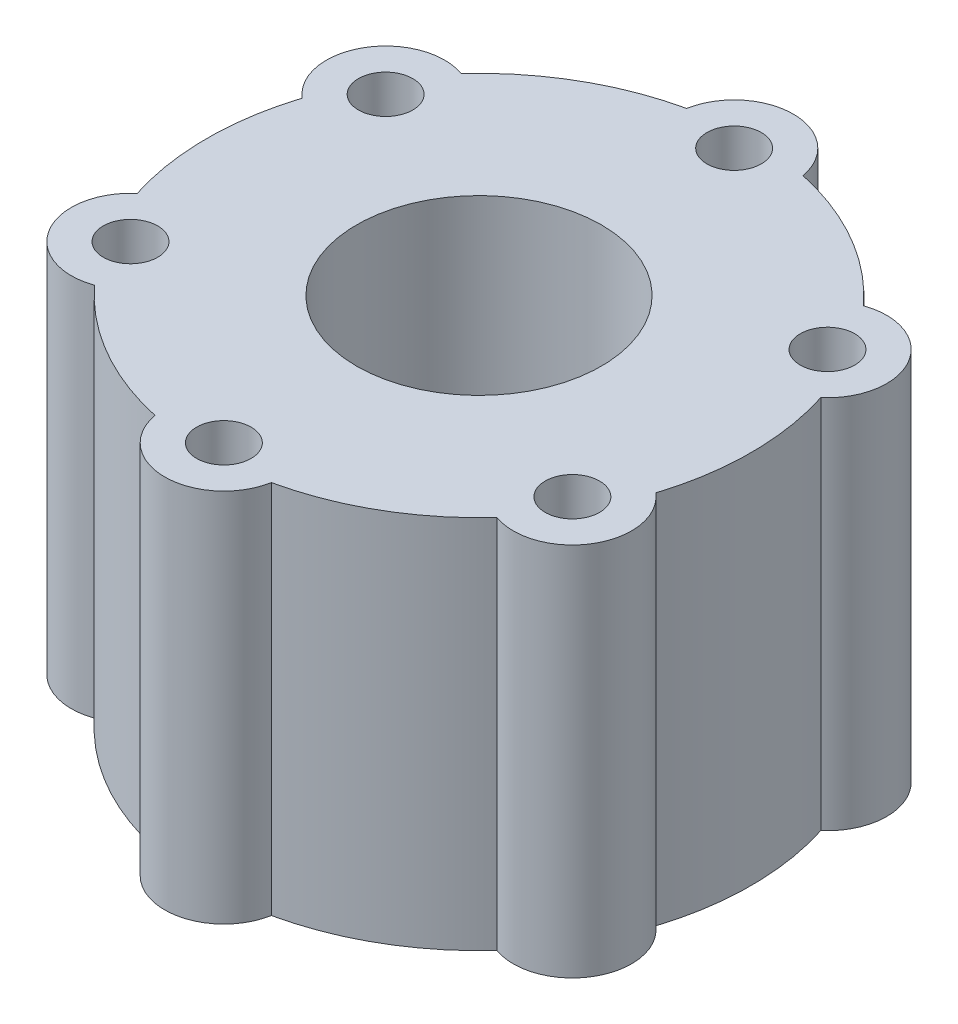
ISO-10303-21;
HEADER;
FILE_DESCRIPTION(('STEP AP214'),'2;1');
FILE_NAME('part.step','',(''),(''),'','','');
FILE_SCHEMA(('AUTOMOTIVE_DESIGN { 1 0 10303 214 1 1 1 1 }'));
ENDSEC;
DATA;
#1=APPLICATION_CONTEXT('core data for automotive mechanical design processes');
#2=APPLICATION_PROTOCOL_DEFINITION('international standard','automotive_design',2000,#1);
#3=PRODUCT_CONTEXT('',#1,'mechanical');
#4=PRODUCT('Part','Part','',(#3));
#5=PRODUCT_RELATED_PRODUCT_CATEGORY('part','',(#4));
#6=PRODUCT_DEFINITION_FORMATION('','',#4);
#7=PRODUCT_DEFINITION_CONTEXT('part definition',#1,'design');
#8=PRODUCT_DEFINITION('design','',#6,#7);
#9=PRODUCT_DEFINITION_SHAPE('','',#8);
#10=(LENGTH_UNIT() NAMED_UNIT(*) SI_UNIT(.MILLI.,.METRE.));
#11=(NAMED_UNIT(*) PLANE_ANGLE_UNIT() SI_UNIT($,.RADIAN.));
#12=(NAMED_UNIT(*) SI_UNIT($,.STERADIAN.) SOLID_ANGLE_UNIT());
#13=UNCERTAINTY_MEASURE_WITH_UNIT(LENGTH_MEASURE(1.E-05),#10,'distance_accuracy_value','');
#14=(GEOMETRIC_REPRESENTATION_CONTEXT(3) GLOBAL_UNCERTAINTY_ASSIGNED_CONTEXT((#13)) GLOBAL_UNIT_ASSIGNED_CONTEXT((#10,
#11,#12)) REPRESENTATION_CONTEXT('',''));
#15=CARTESIAN_POINT('',(0.,0.,0.));
#16=DIRECTION('',(0.,0.,1.));
#17=DIRECTION('',(1.,0.,0.));
#18=AXIS2_PLACEMENT_3D('',#15,#16,#17);
#19=CARTESIAN_POINT('',(0.,0.,-11.90625));
#20=DIRECTION('',(0.,1.,0.));
#21=DIRECTION('',(0.,0.,1.));
#22=AXIS2_PLACEMENT_3D('',#19,#20,#21);
#23=PLANE('',#22);
#24=CARTESIAN_POINT('',(0.,0.,0.));
#25=DIRECTION('',(0.,1.,0.));
#26=DIRECTION('',(0.,0.,1.));
#27=AXIS2_PLACEMENT_3D('',#24,#25,#26);
#28=CIRCLE('',#27,25.4);
#29=CARTESIAN_POINT('',(18.7712276945068,0.,-17.1114292460034));
#30=VERTEX_POINT('',#29);
#31=CARTESIAN_POINT('',(5.43331857484525,0.,-24.8120746666667));
#32=VERTEX_POINT('',#31);
#33=EDGE_CURVE('E226',#30,#32,#28,.T.);
#34=ORIENTED_EDGE('',*,*,#33,.F.);
#35=CARTESIAN_POINT('',(20.6222299276168,0.,-11.9062500000003));
#36=DIRECTION('',(0.,1.,0.));
#37=DIRECTION('',(0.,0.,1.));
#38=AXIS2_PLACEMENT_3D('',#35,#36,#37);
#39=CIRCLE('',#38,5.5245);
#40=CARTESIAN_POINT('',(24.2045462693522,0.,-7.70064542066379));
#41=VERTEX_POINT('',#40);
#42=EDGE_CURVE('E53',#41,#30,#39,.T.);
#43=ORIENTED_EDGE('',*,*,#42,.F.);
#44=CARTESIAN_POINT('',(0.,0.,0.));
#45=DIRECTION('',(0.,1.,0.));
#46=DIRECTION('',(0.,0.,1.));
#47=AXIS2_PLACEMENT_3D('',#44,#45,#46);
#48=CIRCLE('',#47,25.4);
#49=CARTESIAN_POINT('',(24.2045462693524,0.,7.70064542066291));
#50=VERTEX_POINT('',#49);
#51=EDGE_CURVE('E61',#50,#41,#48,.T.);
#52=ORIENTED_EDGE('',*,*,#51,.F.);
#53=CARTESIAN_POINT('',(20.6222299276172,0.,11.9062499999995));
#54=DIRECTION('',(0.,1.,0.));
#55=DIRECTION('',(0.,0.,1.));
#56=AXIS2_PLACEMENT_3D('',#53,#54,#55);
#57=CIRCLE('',#56,5.5245);
#58=CARTESIAN_POINT('',(18.7712276945074,0.,17.1114292460027));
#59=VERTEX_POINT('',#58);
#60=EDGE_CURVE('E244',#59,#50,#57,.T.);
#61=ORIENTED_EDGE('',*,*,#60,.F.);
#62=CARTESIAN_POINT('',(0.,0.,0.));
#63=DIRECTION('',(0.,1.,0.));
#64=DIRECTION('',(0.,0.,1.));
#65=AXIS2_PLACEMENT_3D('',#62,#63,#64);
#66=CIRCLE('',#65,25.4);
#67=CARTESIAN_POINT('',(5.43331857484614,0.,24.8120746666665));
#68=VERTEX_POINT('',#67);
#69=EDGE_CURVE('E242',#68,#59,#66,.T.);
#70=ORIENTED_EDGE('',*,*,#69,.F.);
#71=CARTESIAN_POINT('',(8.6909646146438E-13,0.,23.8125));
#72=DIRECTION('',(0.,1.,0.));
#73=DIRECTION('',(0.,0.,1.));
#74=AXIS2_PLACEMENT_3D('',#71,#72,#73);
#75=CIRCLE('',#74,5.5245);
#76=CARTESIAN_POINT('',(-5.43331857484434,0.,24.8120746666669));
#77=VERTEX_POINT('',#76);
#78=EDGE_CURVE('E240',#77,#68,#75,.T.);
#79=ORIENTED_EDGE('',*,*,#78,.F.);
#80=CARTESIAN_POINT('',(0.,0.,0.));
#81=DIRECTION('',(0.,1.,0.));
#82=DIRECTION('',(0.,0.,1.));
#83=AXIS2_PLACEMENT_3D('',#80,#81,#82);
#84=CIRCLE('',#83,25.4);
#85=CARTESIAN_POINT('',(-18.7712276945066,0.,17.1114292460036));
#86=VERTEX_POINT('',#85);
#87=EDGE_CURVE('E238',#86,#77,#84,.T.);
#88=ORIENTED_EDGE('',*,*,#87,.F.);
#89=CARTESIAN_POINT('',(-20.6222299276167,0.,11.9062500000005));
#90=DIRECTION('',(0.,1.,0.));
#91=DIRECTION('',(0.,0.,1.));
#92=AXIS2_PLACEMENT_3D('',#89,#90,#91);
#93=CIRCLE('',#92,5.5245);
#94=CARTESIAN_POINT('',(-24.2045462693521,0.,7.70064542066408));
#95=VERTEX_POINT('',#94);
#96=EDGE_CURVE('E236',#95,#86,#93,.T.);
#97=ORIENTED_EDGE('',*,*,#96,.F.);
#98=CARTESIAN_POINT('',(0.,0.,0.));
#99=DIRECTION('',(0.,1.,0.));
#100=DIRECTION('',(0.,0.,1.));
#101=AXIS2_PLACEMENT_3D('',#98,#99,#100);
#102=CIRCLE('',#101,25.4);
#103=CARTESIAN_POINT('',(-24.2045462693523,0.,-7.70064542066321));
#104=VERTEX_POINT('',#103);
#105=EDGE_CURVE('E234',#104,#95,#102,.T.);
#106=ORIENTED_EDGE('',*,*,#105,.F.);
#107=CARTESIAN_POINT('',(-20.6222299276171,0.,-11.9062499999997));
#108=DIRECTION('',(0.,1.,0.));
#109=DIRECTION('',(0.,0.,1.));
#110=AXIS2_PLACEMENT_3D('',#107,#108,#109);
#111=CIRCLE('',#110,5.5245);
#112=CARTESIAN_POINT('',(-18.7712276945072,0.,-17.1114292460029));
#113=VERTEX_POINT('',#112);
#114=EDGE_CURVE('E134',#113,#104,#111,.T.);
#115=ORIENTED_EDGE('',*,*,#114,.F.);
#116=CARTESIAN_POINT('',(0.,0.,0.));
#117=DIRECTION('',(0.,1.,0.));
#118=DIRECTION('',(0.,0.,1.));
#119=AXIS2_PLACEMENT_3D('',#116,#117,#118);
#120=CIRCLE('',#119,25.4);
#121=CARTESIAN_POINT('',(-5.43331857484524,0.,-24.8120746666667));
#122=VERTEX_POINT('',#121);
#123=EDGE_CURVE('E231',#122,#113,#120,.T.);
#124=ORIENTED_EDGE('',*,*,#123,.F.);
#125=CARTESIAN_POINT('',(0.,0.,-23.8125));
#126=DIRECTION('',(0.,1.,0.));
#127=DIRECTION('',(0.,0.,1.));
#128=AXIS2_PLACEMENT_3D('',#125,#126,#127);
#129=CIRCLE('',#128,5.52450000000001);
#130=EDGE_CURVE('E229',#32,#122,#129,.T.);
#131=ORIENTED_EDGE('',*,*,#130,.F.);
#132=EDGE_LOOP('',(#34,#43,#52,#61,#70,#79,#88,#97,#106,#115,#124,#131));
#133=FACE_BOUND('',#132,.T.);
#134=CARTESIAN_POINT('',(0.,0.,-23.8125));
#135=DIRECTION('',(0.,1.,0.));
#136=DIRECTION('',(0.,0.,1.));
#137=AXIS2_PLACEMENT_3D('',#134,#135,#136);
#138=CIRCLE('',#137,2.54);
#139=CARTESIAN_POINT('',(0.,0.,-21.2725));
#140=VERTEX_POINT('',#139);
#141=EDGE_CURVE('E223',#140,#140,#138,.T.);
#142=ORIENTED_EDGE('',*,*,#141,.T.);
#143=EDGE_LOOP('',(#142));
#144=FACE_BOUND('',#143,.T.);
#145=CARTESIAN_POINT('',(20.6222299276168,0.,-11.9062500000003));
#146=DIRECTION('',(0.,1.,0.));
#147=DIRECTION('',(0.,0.,1.));
#148=AXIS2_PLACEMENT_3D('',#145,#146,#147);
#149=CIRCLE('',#148,2.54000000000032);
#150=CARTESIAN_POINT('',(20.6222299276168,0.,-9.36624999999993));
#151=VERTEX_POINT('',#150);
#152=EDGE_CURVE('E220',#151,#151,#149,.T.);
#153=ORIENTED_EDGE('',*,*,#152,.T.);
#154=EDGE_LOOP('',(#153));
#155=FACE_BOUND('',#154,.T.);
#156=CARTESIAN_POINT('',(20.6222299276172,0.,11.9062499999995));
#157=DIRECTION('',(0.,1.,0.));
#158=DIRECTION('',(0.,0.,1.));
#159=AXIS2_PLACEMENT_3D('',#156,#157,#158);
#160=CIRCLE('',#159,2.53999999999974);
#161=CARTESIAN_POINT('',(20.6222299276172,0.,14.4462499999992));
#162=VERTEX_POINT('',#161);
#163=EDGE_CURVE('E217',#162,#162,#160,.T.);
#164=ORIENTED_EDGE('',*,*,#163,.T.);
#165=EDGE_LOOP('',(#164));
#166=FACE_BOUND('',#165,.T.);
#167=CARTESIAN_POINT('',(8.6909646146438E-13,0.,23.8125));
#168=DIRECTION('',(0.,1.,0.));
#169=DIRECTION('',(0.,0.,1.));
#170=AXIS2_PLACEMENT_3D('',#167,#168,#169);
#171=CIRCLE('',#170,2.53999999999997);
#172=CARTESIAN_POINT('',(8.6909646146438E-13,0.,26.3525));
#173=VERTEX_POINT('',#172);
#174=EDGE_CURVE('E214',#173,#173,#171,.T.);
#175=ORIENTED_EDGE('',*,*,#174,.T.);
#176=EDGE_LOOP('',(#175));
#177=FACE_BOUND('',#176,.T.);
#178=CARTESIAN_POINT('',(-20.6222299276167,0.,11.9062500000005));
#179=DIRECTION('',(0.,1.,0.));
#180=DIRECTION('',(0.,0.,1.));
#181=AXIS2_PLACEMENT_3D('',#178,#179,#180);
#182=CIRCLE('',#181,2.54);
#183=CARTESIAN_POINT('',(-20.6222299276167,0.,14.4462500000005));
#184=VERTEX_POINT('',#183);
#185=EDGE_CURVE('E211',#184,#184,#182,.T.);
#186=ORIENTED_EDGE('',*,*,#185,.T.);
#187=EDGE_LOOP('',(#186));
#188=FACE_BOUND('',#187,.T.);
#189=CARTESIAN_POINT('',(-20.6222299276171,0.,-11.9062499999997));
#190=DIRECTION('',(0.,1.,0.));
#191=DIRECTION('',(0.,0.,1.));
#192=AXIS2_PLACEMENT_3D('',#189,#190,#191);
#193=CIRCLE('',#192,2.54);
#194=CARTESIAN_POINT('',(-20.6222299276171,0.,-9.36624999999975));
#195=VERTEX_POINT('',#194);
#196=EDGE_CURVE('E208',#195,#195,#193,.T.);
#197=ORIENTED_EDGE('',*,*,#196,.T.);
#198=EDGE_LOOP('',(#197));
#199=FACE_BOUND('',#198,.T.);
#200=CARTESIAN_POINT('',(0.,0.,0.));
#201=DIRECTION('',(0.,1.,0.));
#202=DIRECTION('',(0.,0.,1.));
#203=AXIS2_PLACEMENT_3D('',#200,#201,#202);
#204=CIRCLE('',#203,15.875);
#205=CARTESIAN_POINT('',(0.,0.,15.875));
#206=VERTEX_POINT('',#205);
#207=EDGE_CURVE('E187',#206,#206,#204,.T.);
#208=ORIENTED_EDGE('',*,*,#207,.T.);
#209=EDGE_LOOP('',(#208));
#210=FACE_BOUND('',#209,.T.);
#211=ADVANCED_FACE('F37',(#133,#144,#155,#166,#177,#188,#199,#210),#23,.F.);
#212=CARTESIAN_POINT('',(0.,4.699,0.));
#213=DIRECTION('',(0.,-1.,0.));
#214=DIRECTION('',(0.,0.,-1.));
#215=AXIS2_PLACEMENT_3D('',#212,#213,#214);
#216=CYLINDRICAL_SURFACE('',#215,25.4);
#217=ORIENTED_EDGE('',*,*,#33,.T.);
#218=DIRECTION('',(0.,-1.,0.));
#219=VECTOR('',#218,1.);
#220=CARTESIAN_POINT('',(5.43331857484525,4.699,-24.8120746666667));
#221=LINE('',#220,#219);
#222=CARTESIAN_POINT('',(5.43331857484524,35.,-24.8120746666667));
#223=VERTEX_POINT('',#222);
#224=EDGE_CURVE('E46',#223,#32,#221,.T.);
#225=ORIENTED_EDGE('',*,*,#224,.F.);
#226=CARTESIAN_POINT('',(0.,35.,0.));
#227=DIRECTION('',(0.,-1.,0.));
#228=DIRECTION('',(0.,0.,-1.));
#229=AXIS2_PLACEMENT_3D('',#226,#227,#228);
#230=CIRCLE('',#229,25.4);
#231=CARTESIAN_POINT('',(18.7712276945068,35.,-17.1114292460034));
#232=VERTEX_POINT('',#231);
#233=EDGE_CURVE('E177',#223,#232,#230,.T.);
#234=ORIENTED_EDGE('',*,*,#233,.T.);
#235=DIRECTION('',(0.,-1.,0.));
#236=VECTOR('',#235,1.);
#237=CARTESIAN_POINT('',(18.7712276945068,4.699,-17.1114292460034));
#238=LINE('',#237,#236);
#239=EDGE_CURVE('E248',#232,#30,#238,.T.);
#240=ORIENTED_EDGE('',*,*,#239,.T.);
#241=EDGE_LOOP('',(#217,#225,#234,#240));
#242=FACE_BOUND('',#241,.T.);
#243=ADVANCED_FACE('F39',(#242),#216,.T.);
#244=CARTESIAN_POINT('',(0.,4.699,-23.8125));
#245=DIRECTION('',(0.,-1.,0.));
#246=DIRECTION('',(0.,0.,-1.));
#247=AXIS2_PLACEMENT_3D('',#244,#245,#246);
#248=CYLINDRICAL_SURFACE('',#247,5.52450000000001);
#249=ORIENTED_EDGE('',*,*,#130,.T.);
#250=DIRECTION('',(0.,-1.,0.));
#251=VECTOR('',#250,1.);
#252=CARTESIAN_POINT('',(-5.43331857484524,4.699,-24.8120746666667));
#253=LINE('',#252,#251);
#254=CARTESIAN_POINT('',(-5.43331857484524,35.,-24.8120746666667));
#255=VERTEX_POINT('',#254);
#256=EDGE_CURVE('E269',#255,#122,#253,.T.);
#257=ORIENTED_EDGE('',*,*,#256,.F.);
#258=CARTESIAN_POINT('',(0.,35.,-23.8125));
#259=DIRECTION('',(0.,-1.,0.));
#260=DIRECTION('',(0.,0.,-1.));
#261=AXIS2_PLACEMENT_3D('',#258,#259,#260);
#262=CIRCLE('',#261,5.52450000000001);
#263=EDGE_CURVE('E180',#255,#223,#262,.T.);
#264=ORIENTED_EDGE('',*,*,#263,.T.);
#265=ORIENTED_EDGE('',*,*,#224,.T.);
#266=EDGE_LOOP('',(#249,#257,#264,#265));
#267=FACE_BOUND('',#266,.T.);
#268=ADVANCED_FACE('F273',(#267),#248,.T.);
#269=CARTESIAN_POINT('',(0.,4.699,0.));
#270=DIRECTION('',(0.,-1.,0.));
#271=DIRECTION('',(0.,0.,-1.));
#272=AXIS2_PLACEMENT_3D('',#269,#270,#271);
#273=CYLINDRICAL_SURFACE('',#272,25.4);
#274=ORIENTED_EDGE('',*,*,#123,.T.);
#275=DIRECTION('',(0.,-1.,0.));
#276=VECTOR('',#275,1.);
#277=CARTESIAN_POINT('',(-18.7712276945072,4.699,-17.1114292460029));
#278=LINE('',#277,#276);
#279=CARTESIAN_POINT('',(-18.7712276945072,35.,-17.1114292460029));
#280=VERTEX_POINT('',#279);
#281=EDGE_CURVE('E138',#280,#113,#278,.T.);
#282=ORIENTED_EDGE('',*,*,#281,.F.);
#283=CARTESIAN_POINT('',(0.,35.,0.));
#284=DIRECTION('',(0.,-1.,0.));
#285=DIRECTION('',(0.,0.,-1.));
#286=AXIS2_PLACEMENT_3D('',#283,#284,#285);
#287=CIRCLE('',#286,25.4);
#288=EDGE_CURVE('E150',#280,#255,#287,.T.);
#289=ORIENTED_EDGE('',*,*,#288,.T.);
#290=ORIENTED_EDGE('',*,*,#256,.T.);
#291=EDGE_LOOP('',(#274,#282,#289,#290));
#292=FACE_BOUND('',#291,.T.);
#293=ADVANCED_FACE('F281',(#292),#273,.T.);
#294=CARTESIAN_POINT('',(-20.6222299276171,4.699,-11.9062499999997));
#295=DIRECTION('',(0.,-1.,0.));
#296=DIRECTION('',(0.,0.,-1.));
#297=AXIS2_PLACEMENT_3D('',#294,#295,#296);
#298=CYLINDRICAL_SURFACE('',#297,5.5245);
#299=ORIENTED_EDGE('',*,*,#114,.T.);
#300=DIRECTION('',(0.,-1.,0.));
#301=VECTOR('',#300,1.);
#302=CARTESIAN_POINT('',(-24.2045462693523,4.699,-7.70064542066321));
#303=LINE('',#302,#301);
#304=CARTESIAN_POINT('',(-24.2045462693524,35.,-7.70064542066321));
#305=VERTEX_POINT('',#304);
#306=EDGE_CURVE('E128',#305,#104,#303,.T.);
#307=ORIENTED_EDGE('',*,*,#306,.F.);
#308=CARTESIAN_POINT('',(-20.6222299276171,35.,-11.9062499999997));
#309=DIRECTION('',(0.,-1.,0.));
#310=DIRECTION('',(0.,0.,-1.));
#311=AXIS2_PLACEMENT_3D('',#308,#309,#310);
#312=CIRCLE('',#311,5.5245);
#313=EDGE_CURVE('E132',#305,#280,#312,.T.);
#314=ORIENTED_EDGE('',*,*,#313,.T.);
#315=ORIENTED_EDGE('',*,*,#281,.T.);
#316=EDGE_LOOP('',(#299,#307,#314,#315));
#317=FACE_BOUND('',#316,.T.);
#318=ADVANCED_FACE('F130',(#317),#298,.T.);
#319=CARTESIAN_POINT('',(0.,4.699,0.));
#320=DIRECTION('',(0.,-1.,0.));
#321=DIRECTION('',(0.,0.,-1.));
#322=AXIS2_PLACEMENT_3D('',#319,#320,#321);
#323=CYLINDRICAL_SURFACE('',#322,25.4);
#324=ORIENTED_EDGE('',*,*,#105,.T.);
#325=DIRECTION('',(0.,-1.,0.));
#326=VECTOR('',#325,1.);
#327=CARTESIAN_POINT('',(-24.2045462693521,4.699,7.70064542066408));
#328=LINE('',#327,#326);
#329=CARTESIAN_POINT('',(-24.2045462693521,35.,7.70064542066408));
#330=VERTEX_POINT('',#329);
#331=EDGE_CURVE('E139',#330,#95,#328,.T.);
#332=ORIENTED_EDGE('',*,*,#331,.F.);
#333=CARTESIAN_POINT('',(0.,35.,0.));
#334=DIRECTION('',(0.,-1.,0.));
#335=DIRECTION('',(0.,0.,-1.));
#336=AXIS2_PLACEMENT_3D('',#333,#334,#335);
#337=CIRCLE('',#336,25.4);
#338=EDGE_CURVE('E146',#330,#305,#337,.T.);
#339=ORIENTED_EDGE('',*,*,#338,.T.);
#340=ORIENTED_EDGE('',*,*,#306,.T.);
#341=EDGE_LOOP('',(#324,#332,#339,#340));
#342=FACE_BOUND('',#341,.T.);
#343=ADVANCED_FACE('F152',(#342),#323,.T.);
#344=CARTESIAN_POINT('',(-20.6222299276167,4.699,11.9062500000005));
#345=DIRECTION('',(0.,-1.,0.));
#346=DIRECTION('',(0.,0.,-1.));
#347=AXIS2_PLACEMENT_3D('',#344,#345,#346);
#348=CYLINDRICAL_SURFACE('',#347,5.5245);
#349=ORIENTED_EDGE('',*,*,#96,.T.);
#350=DIRECTION('',(0.,-1.,0.));
#351=VECTOR('',#350,1.);
#352=CARTESIAN_POINT('',(-18.7712276945066,4.699,17.1114292460036));
#353=LINE('',#352,#351);
#354=CARTESIAN_POINT('',(-18.7712276945066,35.,17.1114292460036));
#355=VERTEX_POINT('',#354);
#356=EDGE_CURVE('E264',#355,#86,#353,.T.);
#357=ORIENTED_EDGE('',*,*,#356,.F.);
#358=CARTESIAN_POINT('',(-20.6222299276167,35.,11.9062500000005));
#359=DIRECTION('',(0.,-1.,0.));
#360=DIRECTION('',(0.,0.,-1.));
#361=AXIS2_PLACEMENT_3D('',#358,#359,#360);
#362=CIRCLE('',#361,5.52450000000001);
#363=EDGE_CURVE('E154',#355,#330,#362,.T.);
#364=ORIENTED_EDGE('',*,*,#363,.T.);
#365=ORIENTED_EDGE('',*,*,#331,.T.);
#366=EDGE_LOOP('',(#349,#357,#364,#365));
#367=FACE_BOUND('',#366,.T.);
#368=ADVANCED_FACE('F304',(#367),#348,.T.);
#369=CARTESIAN_POINT('',(0.,4.699,0.));
#370=DIRECTION('',(0.,-1.,0.));
#371=DIRECTION('',(0.,0.,-1.));
#372=AXIS2_PLACEMENT_3D('',#369,#370,#371);
#373=CYLINDRICAL_SURFACE('',#372,25.4);
#374=ORIENTED_EDGE('',*,*,#87,.T.);
#375=DIRECTION('',(0.,-1.,0.));
#376=VECTOR('',#375,1.);
#377=CARTESIAN_POINT('',(-5.43331857484434,4.699,24.8120746666669));
#378=LINE('',#377,#376);
#379=CARTESIAN_POINT('',(-5.43331857484433,35.,24.8120746666669));
#380=VERTEX_POINT('',#379);
#381=EDGE_CURVE('E261',#380,#77,#378,.T.);
#382=ORIENTED_EDGE('',*,*,#381,.F.);
#383=CARTESIAN_POINT('',(0.,35.,0.));
#384=DIRECTION('',(0.,-1.,0.));
#385=DIRECTION('',(0.,0.,-1.));
#386=AXIS2_PLACEMENT_3D('',#383,#384,#385);
#387=CIRCLE('',#386,25.4);
#388=EDGE_CURVE('E156',#380,#355,#387,.T.);
#389=ORIENTED_EDGE('',*,*,#388,.T.);
#390=ORIENTED_EDGE('',*,*,#356,.T.);
#391=EDGE_LOOP('',(#374,#382,#389,#390));
#392=FACE_BOUND('',#391,.T.);
#393=ADVANCED_FACE('F302',(#392),#373,.T.);
#394=CARTESIAN_POINT('',(8.6909646146438E-13,4.699,23.8125));
#395=DIRECTION('',(0.,-1.,0.));
#396=DIRECTION('',(0.,0.,-1.));
#397=AXIS2_PLACEMENT_3D('',#394,#395,#396);
#398=CYLINDRICAL_SURFACE('',#397,5.5245);
#399=ORIENTED_EDGE('',*,*,#78,.T.);
#400=DIRECTION('',(0.,-1.,0.));
#401=VECTOR('',#400,1.);
#402=CARTESIAN_POINT('',(5.43331857484614,4.699,24.8120746666665));
#403=LINE('',#402,#401);
#404=CARTESIAN_POINT('',(5.43331857484614,35.,24.8120746666665));
#405=VERTEX_POINT('',#404);
#406=EDGE_CURVE('E258',#405,#68,#403,.T.);
#407=ORIENTED_EDGE('',*,*,#406,.F.);
#408=CARTESIAN_POINT('',(8.6909646146438E-13,35.,23.8125));
#409=DIRECTION('',(0.,-1.,0.));
#410=DIRECTION('',(0.,0.,-1.));
#411=AXIS2_PLACEMENT_3D('',#408,#409,#410);
#412=CIRCLE('',#411,5.52450000000001);
#413=EDGE_CURVE('E162',#405,#380,#412,.T.);
#414=ORIENTED_EDGE('',*,*,#413,.T.);
#415=ORIENTED_EDGE('',*,*,#381,.T.);
#416=EDGE_LOOP('',(#399,#407,#414,#415));
#417=FACE_BOUND('',#416,.T.);
#418=ADVANCED_FACE('F298',(#417),#398,.T.);
#419=CARTESIAN_POINT('',(0.,4.699,0.));
#420=DIRECTION('',(0.,-1.,0.));
#421=DIRECTION('',(0.,0.,-1.));
#422=AXIS2_PLACEMENT_3D('',#419,#420,#421);
#423=CYLINDRICAL_SURFACE('',#422,25.4);
#424=ORIENTED_EDGE('',*,*,#69,.T.);
#425=DIRECTION('',(0.,-1.,0.));
#426=VECTOR('',#425,1.);
#427=CARTESIAN_POINT('',(18.7712276945074,4.699,17.1114292460027));
#428=LINE('',#427,#426);
#429=CARTESIAN_POINT('',(18.7712276945074,35.,17.1114292460027));
#430=VERTEX_POINT('',#429);
#431=EDGE_CURVE('E255',#430,#59,#428,.T.);
#432=ORIENTED_EDGE('',*,*,#431,.F.);
#433=CARTESIAN_POINT('',(0.,35.,0.));
#434=DIRECTION('',(0.,-1.,0.));
#435=DIRECTION('',(0.,0.,-1.));
#436=AXIS2_PLACEMENT_3D('',#433,#434,#435);
#437=CIRCLE('',#436,25.4);
#438=EDGE_CURVE('E165',#430,#405,#437,.T.);
#439=ORIENTED_EDGE('',*,*,#438,.T.);
#440=ORIENTED_EDGE('',*,*,#406,.T.);
#441=EDGE_LOOP('',(#424,#432,#439,#440));
#442=FACE_BOUND('',#441,.T.);
#443=ADVANCED_FACE('F294',(#442),#423,.T.);
#444=CARTESIAN_POINT('',(20.6222299276172,4.699,11.9062499999995));
#445=DIRECTION('',(0.,-1.,0.));
#446=DIRECTION('',(0.,0.,-1.));
#447=AXIS2_PLACEMENT_3D('',#444,#445,#446);
#448=CYLINDRICAL_SURFACE('',#447,5.5245);
#449=ORIENTED_EDGE('',*,*,#60,.T.);
#450=DIRECTION('',(0.,-1.,0.));
#451=VECTOR('',#450,1.);
#452=CARTESIAN_POINT('',(24.2045462693524,4.699,7.70064542066291));
#453=LINE('',#452,#451);
#454=CARTESIAN_POINT('',(24.2045462693524,35.,7.70064542066291));
#455=VERTEX_POINT('',#454);
#456=EDGE_CURVE('E253',#455,#50,#453,.T.);
#457=ORIENTED_EDGE('',*,*,#456,.F.);
#458=CARTESIAN_POINT('',(20.6222299276172,35.,11.9062499999995));
#459=DIRECTION('',(0.,-1.,0.));
#460=DIRECTION('',(0.,0.,-1.));
#461=AXIS2_PLACEMENT_3D('',#458,#459,#460);
#462=CIRCLE('',#461,5.5245);
#463=EDGE_CURVE('E168',#455,#430,#462,.T.);
#464=ORIENTED_EDGE('',*,*,#463,.T.);
#465=ORIENTED_EDGE('',*,*,#431,.T.);
#466=EDGE_LOOP('',(#449,#457,#464,#465));
#467=FACE_BOUND('',#466,.T.);
#468=ADVANCED_FACE('F291',(#467),#448,.T.);
#469=CARTESIAN_POINT('',(0.,4.699,0.));
#470=DIRECTION('',(0.,-1.,0.));
#471=DIRECTION('',(0.,0.,-1.));
#472=AXIS2_PLACEMENT_3D('',#469,#470,#471);
#473=CYLINDRICAL_SURFACE('',#472,25.4);
#474=ORIENTED_EDGE('',*,*,#51,.T.);
#475=DIRECTION('',(0.,-1.,0.));
#476=VECTOR('',#475,1.);
#477=CARTESIAN_POINT('',(24.2045462693522,4.699,-7.70064542066379));
#478=LINE('',#477,#476);
#479=CARTESIAN_POINT('',(24.2045462693522,35.,-7.70064542066378));
#480=VERTEX_POINT('',#479);
#481=EDGE_CURVE('E250',#480,#41,#478,.T.);
#482=ORIENTED_EDGE('',*,*,#481,.F.);
#483=CARTESIAN_POINT('',(0.,35.,0.));
#484=DIRECTION('',(0.,-1.,0.));
#485=DIRECTION('',(0.,0.,-1.));
#486=AXIS2_PLACEMENT_3D('',#483,#484,#485);
#487=CIRCLE('',#486,25.4);
#488=EDGE_CURVE('E171',#480,#455,#487,.T.);
#489=ORIENTED_EDGE('',*,*,#488,.T.);
#490=ORIENTED_EDGE('',*,*,#456,.T.);
#491=EDGE_LOOP('',(#474,#482,#489,#490));
#492=FACE_BOUND('',#491,.T.);
#493=ADVANCED_FACE('F286',(#492),#473,.T.);
#494=CARTESIAN_POINT('',(20.6222299276168,4.699,-11.9062500000003));
#495=DIRECTION('',(0.,-1.,0.));
#496=DIRECTION('',(0.,0.,-1.));
#497=AXIS2_PLACEMENT_3D('',#494,#495,#496);
#498=CYLINDRICAL_SURFACE('',#497,5.5245);
#499=ORIENTED_EDGE('',*,*,#42,.T.);
#500=ORIENTED_EDGE('',*,*,#239,.F.);
#501=CARTESIAN_POINT('',(20.6222299276168,35.,-11.9062500000003));
#502=DIRECTION('',(0.,-1.,0.));
#503=DIRECTION('',(0.,0.,-1.));
#504=AXIS2_PLACEMENT_3D('',#501,#502,#503);
#505=CIRCLE('',#504,5.5245);
#506=EDGE_CURVE('E174',#232,#480,#505,.T.);
#507=ORIENTED_EDGE('',*,*,#506,.T.);
#508=ORIENTED_EDGE('',*,*,#481,.T.);
#509=EDGE_LOOP('',(#499,#500,#507,#508));
#510=FACE_BOUND('',#509,.T.);
#511=ADVANCED_FACE('F285',(#510),#498,.T.);
#512=CARTESIAN_POINT('',(0.,4.699,-23.8125));
#513=DIRECTION('',(0.,-1.,0.));
#514=DIRECTION('',(0.,0.,-1.));
#515=AXIS2_PLACEMENT_3D('',#512,#513,#514);
#516=CYLINDRICAL_SURFACE('',#515,2.54);
#517=ORIENTED_EDGE('',*,*,#141,.F.);
#518=EDGE_LOOP('',(#517));
#519=FACE_BOUND('',#518,.T.);
#520=CARTESIAN_POINT('',(0.,35.,-23.8125));
#521=DIRECTION('',(0.,-1.,0.));
#522=DIRECTION('',(0.,0.,-1.));
#523=AXIS2_PLACEMENT_3D('',#520,#521,#522);
#524=CIRCLE('',#523,2.54);
#525=CARTESIAN_POINT('',(0.,35.,-26.3525));
#526=VERTEX_POINT('',#525);
#527=EDGE_CURVE('E194',#526,#526,#524,.T.);
#528=ORIENTED_EDGE('',*,*,#527,.F.);
#529=EDGE_LOOP('',(#528));
#530=FACE_BOUND('',#529,.T.);
#531=ADVANCED_FACE('F320',(#519,#530),#516,.F.);
#532=CARTESIAN_POINT('',(20.6222299276168,4.699,-11.9062500000003));
#533=DIRECTION('',(0.,-1.,0.));
#534=DIRECTION('',(0.,0.,-1.));
#535=AXIS2_PLACEMENT_3D('',#532,#533,#534);
#536=CYLINDRICAL_SURFACE('',#535,2.54000000000032);
#537=ORIENTED_EDGE('',*,*,#152,.F.);
#538=EDGE_LOOP('',(#537));
#539=FACE_BOUND('',#538,.T.);
#540=CARTESIAN_POINT('',(20.6222299276168,35.,-11.9062500000003));
#541=DIRECTION('',(0.,-1.,0.));
#542=DIRECTION('',(0.,0.,-1.));
#543=AXIS2_PLACEMENT_3D('',#540,#541,#542);
#544=CIRCLE('',#543,2.54000000000032);
#545=CARTESIAN_POINT('',(20.6222299276168,35.,-14.4462500000006));
#546=VERTEX_POINT('',#545);
#547=EDGE_CURVE('E191',#546,#546,#544,.T.);
#548=ORIENTED_EDGE('',*,*,#547,.F.);
#549=EDGE_LOOP('',(#548));
#550=FACE_BOUND('',#549,.T.);
#551=ADVANCED_FACE('F357',(#539,#550),#536,.F.);
#552=CARTESIAN_POINT('',(20.6222299276172,4.699,11.9062499999995));
#553=DIRECTION('',(0.,-1.,0.));
#554=DIRECTION('',(0.,0.,-1.));
#555=AXIS2_PLACEMENT_3D('',#552,#553,#554);
#556=CYLINDRICAL_SURFACE('',#555,2.53999999999974);
#557=ORIENTED_EDGE('',*,*,#163,.F.);
#558=EDGE_LOOP('',(#557));
#559=FACE_BOUND('',#558,.T.);
#560=CARTESIAN_POINT('',(20.6222299276172,35.,11.9062499999995));
#561=DIRECTION('',(0.,-1.,0.));
#562=DIRECTION('',(0.,0.,-1.));
#563=AXIS2_PLACEMENT_3D('',#560,#561,#562);
#564=CIRCLE('',#563,2.53999999999974);
#565=CARTESIAN_POINT('',(20.6222299276172,35.,9.36624999999976));
#566=VERTEX_POINT('',#565);
#567=EDGE_CURVE('E188',#566,#566,#564,.T.);
#568=ORIENTED_EDGE('',*,*,#567,.F.);
#569=EDGE_LOOP('',(#568));
#570=FACE_BOUND('',#569,.T.);
#571=ADVANCED_FACE('F364',(#559,#570),#556,.F.);
#572=CARTESIAN_POINT('',(8.6909646146438E-13,4.699,23.8125));
#573=DIRECTION('',(0.,-1.,0.));
#574=DIRECTION('',(0.,0.,-1.));
#575=AXIS2_PLACEMENT_3D('',#572,#573,#574);
#576=CYLINDRICAL_SURFACE('',#575,2.53999999999997);
#577=ORIENTED_EDGE('',*,*,#174,.F.);
#578=EDGE_LOOP('',(#577));
#579=FACE_BOUND('',#578,.T.);
#580=CARTESIAN_POINT('',(8.6909646146438E-13,35.,23.8125));
#581=DIRECTION('',(0.,-1.,0.));
#582=DIRECTION('',(0.,0.,-1.));
#583=AXIS2_PLACEMENT_3D('',#580,#581,#582);
#584=CIRCLE('',#583,2.53999999999997);
#585=CARTESIAN_POINT('',(8.6909646146438E-13,35.,21.2725));
#586=VERTEX_POINT('',#585);
#587=EDGE_CURVE('E183',#586,#586,#584,.T.);
#588=ORIENTED_EDGE('',*,*,#587,.F.);
#589=EDGE_LOOP('',(#588));
#590=FACE_BOUND('',#589,.T.);
#591=ADVANCED_FACE('F371',(#579,#590),#576,.F.);
#592=CARTESIAN_POINT('',(-20.6222299276167,4.699,11.9062500000005));
#593=DIRECTION('',(0.,-1.,0.));
#594=DIRECTION('',(0.,0.,-1.));
#595=AXIS2_PLACEMENT_3D('',#592,#593,#594);
#596=CYLINDRICAL_SURFACE('',#595,2.54);
#597=ORIENTED_EDGE('',*,*,#185,.F.);
#598=EDGE_LOOP('',(#597));
#599=FACE_BOUND('',#598,.T.);
#600=CARTESIAN_POINT('',(-20.6222299276167,35.,11.9062500000005));
#601=DIRECTION('',(0.,-1.,0.));
#602=DIRECTION('',(0.,0.,-1.));
#603=AXIS2_PLACEMENT_3D('',#600,#601,#602);
#604=CIRCLE('',#603,2.54);
#605=CARTESIAN_POINT('',(-20.6222299276167,35.,9.3662500000005));
#606=VERTEX_POINT('',#605);
#607=EDGE_CURVE('E200',#606,#606,#604,.T.);
#608=ORIENTED_EDGE('',*,*,#607,.F.);
#609=EDGE_LOOP('',(#608));
#610=FACE_BOUND('',#609,.T.);
#611=ADVANCED_FACE('F379',(#599,#610),#596,.F.);
#612=CARTESIAN_POINT('',(-20.6222299276171,4.699,-11.9062499999997));
#613=DIRECTION('',(0.,-1.,0.));
#614=DIRECTION('',(0.,0.,-1.));
#615=AXIS2_PLACEMENT_3D('',#612,#613,#614);
#616=CYLINDRICAL_SURFACE('',#615,2.54);
#617=ORIENTED_EDGE('',*,*,#196,.F.);
#618=EDGE_LOOP('',(#617));
#619=FACE_BOUND('',#618,.T.);
#620=CARTESIAN_POINT('',(-20.6222299276171,35.,-11.9062499999997));
#621=DIRECTION('',(0.,-1.,0.));
#622=DIRECTION('',(0.,0.,-1.));
#623=AXIS2_PLACEMENT_3D('',#620,#621,#622);
#624=CIRCLE('',#623,2.54);
#625=CARTESIAN_POINT('',(-20.6222299276171,35.,-14.4462499999998));
#626=VERTEX_POINT('',#625);
#627=EDGE_CURVE('E197',#626,#626,#624,.T.);
#628=ORIENTED_EDGE('',*,*,#627,.F.);
#629=EDGE_LOOP('',(#628));
#630=FACE_BOUND('',#629,.T.);
#631=ADVANCED_FACE('F387',(#619,#630),#616,.F.);
#632=CARTESIAN_POINT('',(0.,4.699,0.));
#633=DIRECTION('',(0.,-1.,0.));
#634=DIRECTION('',(0.,0.,-1.));
#635=AXIS2_PLACEMENT_3D('',#632,#633,#634);
#636=CYLINDRICAL_SURFACE('',#635,15.875);
#637=CARTESIAN_POINT('',(0.,2.0748,0.));
#638=DIRECTION('',(0.,-1.,0.));
#639=DIRECTION('',(0.,0.,-1.));
#640=AXIS2_PLACEMENT_3D('',#637,#638,#639);
#641=CIRCLE('',#640,15.875);
#642=CARTESIAN_POINT('',(0.,2.0748,-15.875));
#643=VERTEX_POINT('',#642);
#644=EDGE_CURVE('E11',#643,#643,#641,.T.);
#645=ORIENTED_EDGE('',*,*,#644,.F.);
#646=EDGE_LOOP('',(#645));
#647=FACE_BOUND('',#646,.T.);
#648=ORIENTED_EDGE('',*,*,#207,.F.);
#649=EDGE_LOOP('',(#648));
#650=FACE_BOUND('',#649,.T.);
#651=ADVANCED_FACE('F395',(#647,#650),#636,.F.);
#652=CARTESIAN_POINT('',(0.,113.59544655787,0.));
#653=DIRECTION('',(0.,-1.,0.));
#654=DIRECTION('',(0.,0.,-1.));
#655=AXIS2_PLACEMENT_3D('',#652,#653,#654);
#656=CYLINDRICAL_SURFACE('',#655,11.426);
#657=CARTESIAN_POINT('',(0.,35.,0.));
#658=DIRECTION('',(0.,-1.,0.));
#659=DIRECTION('',(0.,0.,-1.));
#660=AXIS2_PLACEMENT_3D('',#657,#658,#659);
#661=CIRCLE('',#660,11.426);
#662=CARTESIAN_POINT('',(0.,35.,-11.426));
#663=VERTEX_POINT('',#662);
#664=EDGE_CURVE('E184',#663,#663,#661,.T.);
#665=ORIENTED_EDGE('',*,*,#664,.F.);
#666=EDGE_LOOP('',(#665));
#667=FACE_BOUND('',#666,.T.);
#668=CARTESIAN_POINT('',(0.,4.699,0.));
#669=DIRECTION('',(0.,1.,0.));
#670=DIRECTION('',(0.,0.,1.));
#671=AXIS2_PLACEMENT_3D('',#668,#669,#670);
#672=CIRCLE('',#671,11.426);
#673=CARTESIAN_POINT('',(0.,4.699,11.426));
#674=VERTEX_POINT('',#673);
#675=EDGE_CURVE('E566',#674,#674,#672,.T.);
#676=ORIENTED_EDGE('',*,*,#675,.F.);
#677=EDGE_LOOP('',(#676));
#678=FACE_BOUND('',#677,.T.);
#679=ADVANCED_FACE('F404',(#667,#678),#656,.F.);
#680=CARTESIAN_POINT('',(0.,35.,0.));
#681=DIRECTION('',(0.,-1.,0.));
#682=DIRECTION('',(0.,0.,-1.));
#683=AXIS2_PLACEMENT_3D('',#680,#681,#682);
#684=PLANE('',#683);
#685=ORIENTED_EDGE('',*,*,#587,.T.);
#686=EDGE_LOOP('',(#685));
#687=FACE_BOUND('',#686,.T.);
#688=ORIENTED_EDGE('',*,*,#607,.T.);
#689=EDGE_LOOP('',(#688));
#690=FACE_BOUND('',#689,.T.);
#691=ORIENTED_EDGE('',*,*,#627,.T.);
#692=EDGE_LOOP('',(#691));
#693=FACE_BOUND('',#692,.T.);
#694=ORIENTED_EDGE('',*,*,#527,.T.);
#695=EDGE_LOOP('',(#694));
#696=FACE_BOUND('',#695,.T.);
#697=ORIENTED_EDGE('',*,*,#547,.T.);
#698=EDGE_LOOP('',(#697));
#699=FACE_BOUND('',#698,.T.);
#700=ORIENTED_EDGE('',*,*,#567,.T.);
#701=EDGE_LOOP('',(#700));
#702=FACE_BOUND('',#701,.T.);
#703=ORIENTED_EDGE('',*,*,#664,.T.);
#704=EDGE_LOOP('',(#703));
#705=FACE_BOUND('',#704,.T.);
#706=ORIENTED_EDGE('',*,*,#313,.F.);
#707=ORIENTED_EDGE('',*,*,#338,.F.);
#708=ORIENTED_EDGE('',*,*,#363,.F.);
#709=ORIENTED_EDGE('',*,*,#388,.F.);
#710=ORIENTED_EDGE('',*,*,#413,.F.);
#711=ORIENTED_EDGE('',*,*,#438,.F.);
#712=ORIENTED_EDGE('',*,*,#463,.F.);
#713=ORIENTED_EDGE('',*,*,#488,.F.);
#714=ORIENTED_EDGE('',*,*,#506,.F.);
#715=ORIENTED_EDGE('',*,*,#233,.F.);
#716=ORIENTED_EDGE('',*,*,#263,.F.);
#717=ORIENTED_EDGE('',*,*,#288,.F.);
#718=EDGE_LOOP('',(#706,#707,#708,#709,#710,#711,#712,#713,#714,#715,#716,#717));
#719=FACE_BOUND('',#718,.T.);
#720=ADVANCED_FACE('F144',(#687,#690,#693,#696,#699,#702,#705,#719),#684,.F.);
#721=CARTESIAN_POINT('',(0.,4.699,0.));
#722=DIRECTION('',(0.,-1.,0.));
#723=DIRECTION('',(0.,0.,-1.));
#724=AXIS2_PLACEMENT_3D('',#721,#722,#723);
#725=CONICAL_SURFACE('',#724,11.426,1.03788060365844);
#726=ORIENTED_EDGE('',*,*,#644,.T.);
#727=EDGE_LOOP('',(#726));
#728=FACE_BOUND('',#727,.T.);
#729=ORIENTED_EDGE('',*,*,#675,.T.);
#730=EDGE_LOOP('',(#729));
#731=FACE_BOUND('',#730,.T.);
#732=ADVANCED_FACE('F419',(#728,#731),#725,.F.);
#733=CLOSED_SHELL('',(#211,#243,#268,#293,#318,#343,#368,#393,#418,#443,#468,#493,#511,#531,
#551,#571,#591,#611,#631,#651,#679,#720,#732));
#734=MANIFOLD_SOLID_BREP('B2',#733);
#735=ADVANCED_BREP_SHAPE_REPRESENTATION('',(#18,#734),#14);
#736=SHAPE_DEFINITION_REPRESENTATION(#9,#735);
ENDSEC;
END-ISO-10303-21;
